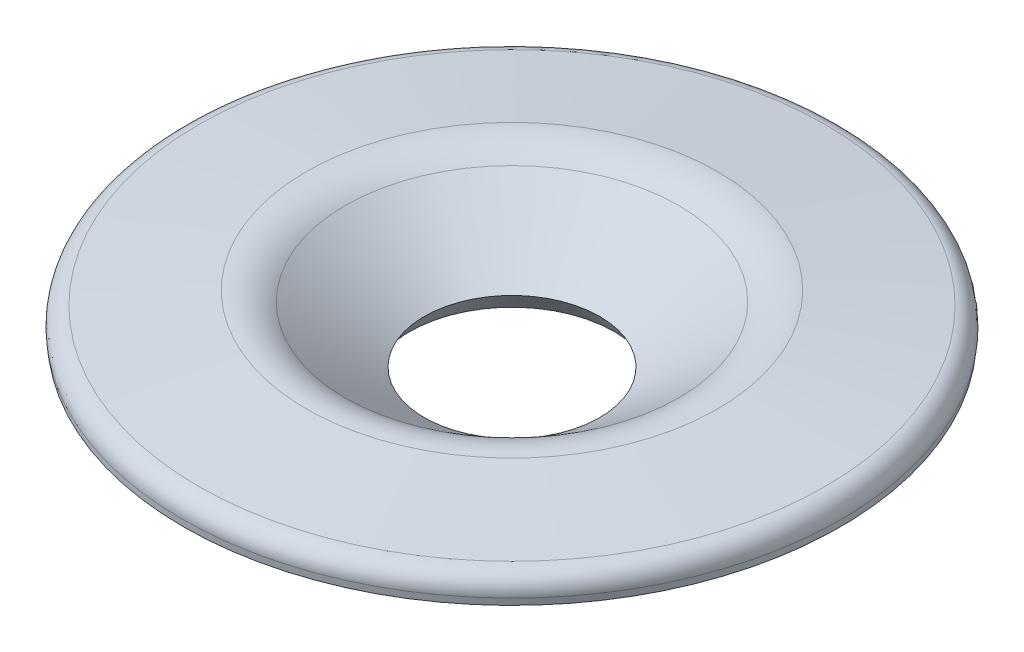
ISO-10303-21;
HEADER;
FILE_DESCRIPTION(('STEP AP214'),'2;1');
FILE_NAME('part.step','',(''),(''),'','','');
FILE_SCHEMA(('AUTOMOTIVE_DESIGN { 1 0 10303 214 1 1 1 1 }'));
ENDSEC;
DATA;
#1=APPLICATION_CONTEXT('core data for automotive mechanical design processes');
#2=APPLICATION_PROTOCOL_DEFINITION('international standard','automotive_design',2000,#1);
#3=PRODUCT_CONTEXT('',#1,'mechanical');
#4=PRODUCT('Part','Part','',(#3));
#5=PRODUCT_RELATED_PRODUCT_CATEGORY('part','',(#4));
#6=PRODUCT_DEFINITION_FORMATION('','',#4);
#7=PRODUCT_DEFINITION_CONTEXT('part definition',#1,'design');
#8=PRODUCT_DEFINITION('design','',#6,#7);
#9=PRODUCT_DEFINITION_SHAPE('','',#8);
#10=(LENGTH_UNIT() NAMED_UNIT(*) SI_UNIT(.MILLI.,.METRE.));
#11=(NAMED_UNIT(*) PLANE_ANGLE_UNIT() SI_UNIT($,.RADIAN.));
#12=(NAMED_UNIT(*) SI_UNIT($,.STERADIAN.) SOLID_ANGLE_UNIT());
#13=UNCERTAINTY_MEASURE_WITH_UNIT(LENGTH_MEASURE(1.E-05),#10,'distance_accuracy_value','');
#14=(GEOMETRIC_REPRESENTATION_CONTEXT(3) GLOBAL_UNCERTAINTY_ASSIGNED_CONTEXT((#13)) GLOBAL_UNIT_ASSIGNED_CONTEXT((#10,
#11,#12)) REPRESENTATION_CONTEXT('',''));
#15=CARTESIAN_POINT('',(0.,0.,0.));
#16=DIRECTION('',(0.,0.,1.));
#17=DIRECTION('',(1.,0.,0.));
#18=AXIS2_PLACEMENT_3D('',#15,#16,#17);
#19=CARTESIAN_POINT('',(0.,2.23811797817187,0.));
#20=DIRECTION('',(0.,-1.,0.));
#21=DIRECTION('',(0.,0.,-1.));
#22=AXIS2_PLACEMENT_3D('',#19,#20,#21);
#23=CONICAL_SURFACE('',#22,10.992377676947,1.44890362336304);
#24=CARTESIAN_POINT('',(0.,1.40023921635742,0.));
#25=DIRECTION('',(0.,-1.,0.));
#26=DIRECTION('',(0.,0.,-1.));
#27=AXIS2_PLACEMENT_3D('',#24,#25,#26);
#28=CIRCLE('',#27,17.8322043040038);
#29=CARTESIAN_POINT('',(0.,1.40023921635742,-17.8322043040038));
#30=VERTEX_POINT('',#29);
#31=EDGE_CURVE('E66',#30,#30,#28,.T.);
#32=ORIENTED_EDGE('',*,*,#31,.T.);
#33=EDGE_LOOP('',(#32));
#34=FACE_BOUND('',#33,.T.);
#35=CARTESIAN_POINT('',(0.,2.23811797817187,0.));
#36=DIRECTION('',(0.,-1.,0.));
#37=DIRECTION('',(0.,0.,-1.));
#38=AXIS2_PLACEMENT_3D('',#35,#36,#37);
#39=CIRCLE('',#38,10.992377676947);
#40=CARTESIAN_POINT('',(0.,2.23811797817187,-10.992377676947));
#41=VERTEX_POINT('',#40);
#42=EDGE_CURVE('E45',#41,#41,#39,.T.);
#43=ORIENTED_EDGE('',*,*,#42,.F.);
#44=EDGE_LOOP('',(#43));
#45=FACE_BOUND('',#44,.T.);
#46=ADVANCED_FACE('F34',(#34,#45),#23,.F.);
#47=CARTESIAN_POINT('',(0.,0.630137927808837,0.));
#48=DIRECTION('',(0.,-1.,0.));
#49=DIRECTION('',(0.,0.,-1.));
#50=AXIS2_PLACEMENT_3D('',#47,#48,#49);
#51=TOROIDAL_SURFACE('',#50,10.7954001207775,1.62);
#52=ORIENTED_EDGE('',*,*,#42,.T.);
#53=EDGE_LOOP('',(#52));
#54=FACE_BOUND('',#53,.T.);
#55=CARTESIAN_POINT('',(0.,1.9475362503467,0.));
#56=DIRECTION('',(0.,-1.,0.));
#57=DIRECTION('',(0.,0.,-1.));
#58=AXIS2_PLACEMENT_3D('',#55,#56,#57);
#59=CIRCLE('',#58,9.85260551972467);
#60=CARTESIAN_POINT('',(0.,1.9475362503467,-9.85260551972467));
#61=VERTEX_POINT('',#60);
#62=EDGE_CURVE('E49',#61,#61,#59,.T.);
#63=ORIENTED_EDGE('',*,*,#62,.F.);
#64=EDGE_LOOP('',(#63));
#65=FACE_BOUND('',#64,.T.);
#66=ADVANCED_FACE('F84',(#54,#65),#51,.F.);
#67=CARTESIAN_POINT('',(0.,-1.1222282006804,0.));
#68=DIRECTION('',(0.,1.,0.));
#69=DIRECTION('',(0.,0.,1.));
#70=AXIS2_PLACEMENT_3D('',#67,#68,#69);
#71=CONICAL_SURFACE('',#70,5.56312132682281,0.949644802449478);
#72=ORIENTED_EDGE('',*,*,#62,.T.);
#73=EDGE_LOOP('',(#72));
#74=FACE_BOUND('',#73,.T.);
#75=CARTESIAN_POINT('',(0.,-1.1222282006804,0.));
#76=DIRECTION('',(0.,-1.,0.));
#77=DIRECTION('',(0.,0.,-1.));
#78=AXIS2_PLACEMENT_3D('',#75,#76,#77);
#79=CIRCLE('',#78,5.56312132682281);
#80=CARTESIAN_POINT('',(0.,-1.1222282006804,-5.56312132682281));
#81=VERTEX_POINT('',#80);
#82=EDGE_CURVE('E54',#81,#81,#79,.T.);
#83=ORIENTED_EDGE('',*,*,#82,.F.);
#84=EDGE_LOOP('',(#83));
#85=FACE_BOUND('',#84,.T.);
#86=ADVANCED_FACE('F88',(#74,#85),#71,.T.);
#87=CARTESIAN_POINT('',(0.,-1.1222282006804,0.));
#88=DIRECTION('',(0.,-1.,0.));
#89=DIRECTION('',(0.,0.,-1.));
#90=AXIS2_PLACEMENT_3D('',#87,#88,#89);
#91=CONICAL_SURFACE('',#90,5.56312132682281,0.621151524345419);
#92=CARTESIAN_POINT('',(0.,0.,0.));
#93=DIRECTION('',(0.,-1.,0.));
#94=DIRECTION('',(0.,0.,-1.));
#95=AXIS2_PLACEMENT_3D('',#92,#93,#94);
#96=CIRCLE('',#95,4.76);
#97=CARTESIAN_POINT('',(0.,0.,-4.76));
#98=VERTEX_POINT('',#97);
#99=EDGE_CURVE('E57',#98,#98,#96,.T.);
#100=ORIENTED_EDGE('',*,*,#99,.F.);
#101=EDGE_LOOP('',(#100));
#102=FACE_BOUND('',#101,.T.);
#103=ORIENTED_EDGE('',*,*,#82,.T.);
#104=EDGE_LOOP('',(#103));
#105=FACE_BOUND('',#104,.T.);
#106=ADVANCED_FACE('F94',(#102,#105),#91,.F.);
#107=CARTESIAN_POINT('',(0.,0.,0.));
#108=DIRECTION('',(0.,1.,0.));
#109=DIRECTION('',(0.,0.,1.));
#110=AXIS2_PLACEMENT_3D('',#107,#108,#109);
#111=CONICAL_SURFACE('',#110,4.76,0.949644802449478);
#112=CARTESIAN_POINT('',(0.,3.0697644510271,0.));
#113=DIRECTION('',(0.,-1.,0.));
#114=DIRECTION('',(0.,0.,-1.));
#115=AXIS2_PLACEMENT_3D('',#112,#113,#114);
#116=CIRCLE('',#115,9.04948419290186);
#117=CARTESIAN_POINT('',(0.,3.0697644510271,-9.04948419290186));
#118=VERTEX_POINT('',#117);
#119=EDGE_CURVE('E60',#118,#118,#116,.T.);
#120=ORIENTED_EDGE('',*,*,#119,.F.);
#121=EDGE_LOOP('',(#120));
#122=FACE_BOUND('',#121,.T.);
#123=ORIENTED_EDGE('',*,*,#99,.T.);
#124=EDGE_LOOP('',(#123));
#125=FACE_BOUND('',#124,.T.);
#126=ADVANCED_FACE('F98',(#122,#125),#111,.F.);
#127=CARTESIAN_POINT('',(0.,0.630137927808837,0.));
#128=DIRECTION('',(0.,-1.,0.));
#129=DIRECTION('',(0.,0.,-1.));
#130=AXIS2_PLACEMENT_3D('',#127,#128,#129);
#131=TOROIDAL_SURFACE('',#130,10.7954001207775,3.);
#132=CARTESIAN_POINT('',(0.,3.60787876181445,0.));
#133=DIRECTION('',(0.,-1.,0.));
#134=DIRECTION('',(0.,0.,-1.));
#135=AXIS2_PLACEMENT_3D('',#132,#133,#134);
#136=CIRCLE('',#135,11.1601733729432);
#137=CARTESIAN_POINT('',(0.,3.60787876181445,-11.1601733729432));
#138=VERTEX_POINT('',#137);
#139=EDGE_CURVE('E63',#138,#138,#136,.T.);
#140=ORIENTED_EDGE('',*,*,#139,.F.);
#141=EDGE_LOOP('',(#140));
#142=FACE_BOUND('',#141,.T.);
#143=ORIENTED_EDGE('',*,*,#119,.T.);
#144=EDGE_LOOP('',(#143));
#145=FACE_BOUND('',#144,.T.);
#146=ADVANCED_FACE('F81',(#142,#145),#131,.T.);
#147=CARTESIAN_POINT('',(0.,3.60787876181445,0.));
#148=DIRECTION('',(0.,-1.,0.));
#149=DIRECTION('',(0.,0.,-1.));
#150=AXIS2_PLACEMENT_3D('',#147,#148,#149);
#151=CONICAL_SURFACE('',#150,11.1601733729432,1.44890362336304);
#152=CARTESIAN_POINT('',(0.,2.89159108405523,0.));
#153=DIRECTION('',(0.,1.,0.));
#154=DIRECTION('',(0.,0.,1.));
#155=AXIS2_PLACEMENT_3D('',#152,#153,#154);
#156=CIRCLE('',#155,17.0074197219981);
#157=CARTESIAN_POINT('',(0.,2.89159108405523,17.0074197219981));
#158=VERTEX_POINT('',#157);
#159=EDGE_CURVE('E10',#158,#158,#156,.T.);
#160=ORIENTED_EDGE('',*,*,#159,.T.);
#161=EDGE_LOOP('',(#160));
#162=FACE_BOUND('',#161,.T.);
#163=ORIENTED_EDGE('',*,*,#139,.T.);
#164=EDGE_LOOP('',(#163));
#165=FACE_BOUND('',#164,.T.);
#166=ADVANCED_FACE('F74',(#162,#165),#151,.T.);
#167=CARTESIAN_POINT('',(0.,2.77,0.));
#168=DIRECTION('',(0.,1.,0.));
#169=DIRECTION('',(0.,0.,1.));
#170=AXIS2_PLACEMENT_3D('',#167,#168,#169);
#171=CONICAL_SURFACE('',#170,18.,0.121892703431859);
#172=CARTESIAN_POINT('',(0.,1.77741972199816,0.));
#173=DIRECTION('',(0.,-1.,0.));
#174=DIRECTION('',(0.,0.,-1.));
#175=AXIS2_PLACEMENT_3D('',#172,#173,#174);
#176=CIRCLE('',#175,17.8784089159448);
#177=CARTESIAN_POINT('',(0.,1.77741972199816,-17.8784089159448));
#178=VERTEX_POINT('',#177);
#179=EDGE_CURVE('E41',#178,#178,#176,.T.);
#180=ORIENTED_EDGE('',*,*,#179,.T.);
#181=EDGE_LOOP('',(#180));
#182=FACE_BOUND('',#181,.T.);
#183=ORIENTED_EDGE('',*,*,#31,.F.);
#184=EDGE_LOOP('',(#183));
#185=FACE_BOUND('',#184,.T.);
#186=ADVANCED_FACE('F72',(#182,#185),#171,.T.);
#187=CARTESIAN_POINT('',(0.,1.89901080605336,0.));
#188=DIRECTION('',(0.,1.,0.));
#189=DIRECTION('',(0.,0.,1.));
#190=AXIS2_PLACEMENT_3D('',#187,#188,#189);
#191=TOROIDAL_SURFACE('',#190,16.8858286379429,1.);
#192=ORIENTED_EDGE('',*,*,#159,.F.);
#193=EDGE_LOOP('',(#192));
#194=FACE_BOUND('',#193,.T.);
#195=ORIENTED_EDGE('',*,*,#179,.F.);
#196=EDGE_LOOP('',(#195));
#197=FACE_BOUND('',#196,.T.);
#198=ADVANCED_FACE('F36',(#194,#197),#191,.T.);
#199=CLOSED_SHELL('',(#46,#66,#86,#106,#126,#146,#166,#186,#198));
#200=MANIFOLD_SOLID_BREP('B2',#199);
#201=ADVANCED_BREP_SHAPE_REPRESENTATION('',(#18,#200),#14);
#202=SHAPE_DEFINITION_REPRESENTATION(#9,#201);
ENDSEC;
END-ISO-10303-21;
